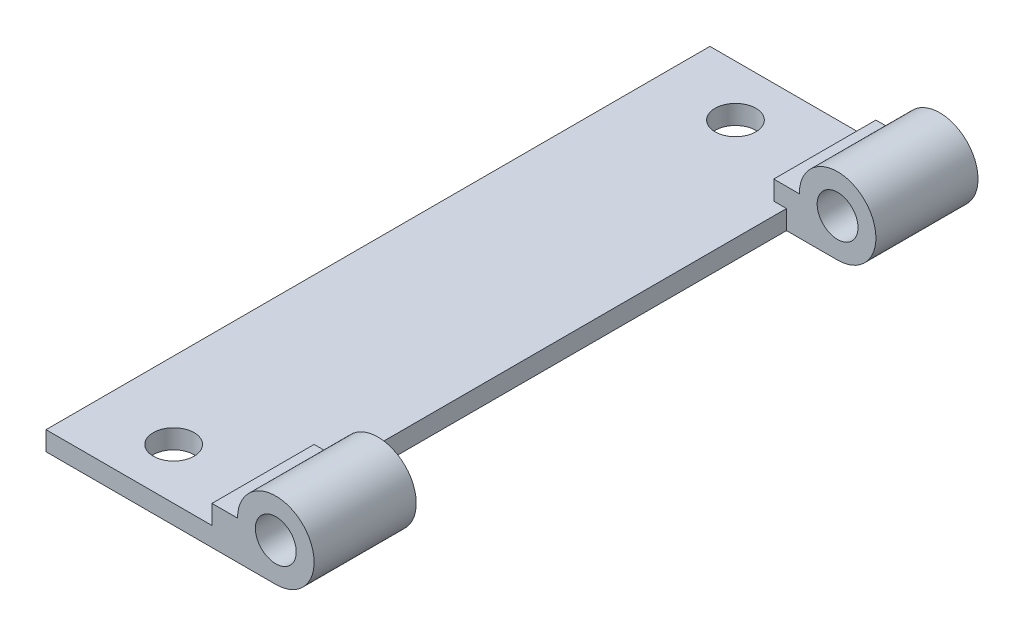
ISO-10303-21;
HEADER;
FILE_DESCRIPTION(('STEP AP214'),'2;1');
FILE_NAME('part.step','',(''),(''),'','','');
FILE_SCHEMA(('AUTOMOTIVE_DESIGN { 1 0 10303 214 1 1 1 1 }'));
ENDSEC;
DATA;
#1=APPLICATION_CONTEXT('core data for automotive mechanical design processes');
#2=APPLICATION_PROTOCOL_DEFINITION('international standard','automotive_design',2000,#1);
#3=PRODUCT_CONTEXT('',#1,'mechanical');
#4=PRODUCT('Part','Part','',(#3));
#5=PRODUCT_RELATED_PRODUCT_CATEGORY('part','',(#4));
#6=PRODUCT_DEFINITION_FORMATION('','',#4);
#7=PRODUCT_DEFINITION_CONTEXT('part definition',#1,'design');
#8=PRODUCT_DEFINITION('design','',#6,#7);
#9=PRODUCT_DEFINITION_SHAPE('','',#8);
#10=(LENGTH_UNIT() NAMED_UNIT(*) SI_UNIT(.MILLI.,.METRE.));
#11=(NAMED_UNIT(*) PLANE_ANGLE_UNIT() SI_UNIT($,.RADIAN.));
#12=(NAMED_UNIT(*) SI_UNIT($,.STERADIAN.) SOLID_ANGLE_UNIT());
#13=UNCERTAINTY_MEASURE_WITH_UNIT(LENGTH_MEASURE(1.E-05),#10,'distance_accuracy_value','');
#14=(GEOMETRIC_REPRESENTATION_CONTEXT(3) GLOBAL_UNCERTAINTY_ASSIGNED_CONTEXT((#13)) GLOBAL_UNIT_ASSIGNED_CONTEXT((#10,
#11,#12)) REPRESENTATION_CONTEXT('',''));
#15=CARTESIAN_POINT('',(0.,0.,0.));
#16=DIRECTION('',(0.,0.,1.));
#17=DIRECTION('',(1.,0.,0.));
#18=AXIS2_PLACEMENT_3D('',#15,#16,#17);
#19=CARTESIAN_POINT('',(0.,0.,26.));
#20=DIRECTION('',(0.,-1.,0.));
#21=DIRECTION('',(0.,0.,-1.));
#22=AXIS2_PLACEMENT_3D('',#19,#20,#21);
#23=PLANE('',#22);
#24=DIRECTION('',(0.,0.,-1.));
#25=VECTOR('',#24,1.);
#26=CARTESIAN_POINT('',(-3.,0.,26.));
#27=LINE('',#26,#25);
#28=CARTESIAN_POINT('',(-3.,0.,18.));
#29=VERTEX_POINT('',#28);
#30=CARTESIAN_POINT('',(-3.,0.,26.));
#31=VERTEX_POINT('',#30);
#32=EDGE_CURVE('E11',#29,#31,#27,.F.);
#33=ORIENTED_EDGE('',*,*,#32,.F.);
#34=DIRECTION('',(-1.,0.,0.));
#35=VECTOR('',#34,1.);
#36=CARTESIAN_POINT('',(0.,0.,18.));
#37=LINE('',#36,#35);
#38=CARTESIAN_POINT('',(-5.,0.,18.));
#39=VERTEX_POINT('',#38);
#40=EDGE_CURVE('E131',#29,#39,#37,.T.);
#41=ORIENTED_EDGE('',*,*,#40,.T.);
#42=DIRECTION('',(0.,0.,-1.));
#43=VECTOR('',#42,1.);
#44=CARTESIAN_POINT('',(-5.,0.,26.));
#45=LINE('',#44,#43);
#46=CARTESIAN_POINT('',(-5.,0.,26.));
#47=VERTEX_POINT('',#46);
#48=EDGE_CURVE('E160',#47,#39,#45,.T.);
#49=ORIENTED_EDGE('',*,*,#48,.F.);
#50=DIRECTION('',(-1.,0.,0.));
#51=VECTOR('',#50,1.);
#52=CARTESIAN_POINT('',(0.,0.,26.));
#53=LINE('',#52,#51);
#54=EDGE_CURVE('E56',#31,#47,#53,.T.);
#55=ORIENTED_EDGE('',*,*,#54,.F.);
#56=EDGE_LOOP('',(#33,#41,#49,#55));
#57=FACE_BOUND('',#56,.T.);
#58=ADVANCED_FACE('F39',(#57),#23,.F.);
#59=CARTESIAN_POINT('',(-4.,-1.5,26.));
#60=DIRECTION('',(0.,-1.,0.));
#61=DIRECTION('',(0.,0.,-1.));
#62=AXIS2_PLACEMENT_3D('',#59,#60,#61);
#63=PLANE('',#62);
#64=CARTESIAN_POINT('',(-12.,-1.5,22.));
#65=DIRECTION('',(0.,-1.,0.));
#66=DIRECTION('',(0.,0.,-1.));
#67=AXIS2_PLACEMENT_3D('',#64,#65,#66);
#68=CIRCLE('',#67,1.6);
#69=CARTESIAN_POINT('',(-12.,-1.5,20.4));
#70=VERTEX_POINT('',#69);
#71=EDGE_CURVE('E235',#70,#70,#68,.T.);
#72=ORIENTED_EDGE('',*,*,#71,.T.);
#73=EDGE_LOOP('',(#72));
#74=FACE_BOUND('',#73,.T.);
#75=CARTESIAN_POINT('',(-12.,-1.5,-22.));
#76=DIRECTION('',(0.,-1.,0.));
#77=DIRECTION('',(0.,0.,-1.));
#78=AXIS2_PLACEMENT_3D('',#75,#76,#77);
#79=CIRCLE('',#78,1.6);
#80=CARTESIAN_POINT('',(-12.,-1.5,-23.6));
#81=VERTEX_POINT('',#80);
#82=EDGE_CURVE('E232',#81,#81,#79,.T.);
#83=ORIENTED_EDGE('',*,*,#82,.T.);
#84=EDGE_LOOP('',(#83));
#85=FACE_BOUND('',#84,.T.);
#86=DIRECTION('',(0.,0.,1.));
#87=VECTOR('',#86,1.);
#88=CARTESIAN_POINT('',(-5.,-1.5,26.));
#89=LINE('',#88,#87);
#90=CARTESIAN_POINT('',(-5.,-1.5,18.));
#91=VERTEX_POINT('',#90);
#92=CARTESIAN_POINT('',(-5.,-1.5,26.));
#93=VERTEX_POINT('',#92);
#94=EDGE_CURVE('E63',#91,#93,#89,.T.);
#95=ORIENTED_EDGE('',*,*,#94,.F.);
#96=DIRECTION('',(-1.,0.,0.));
#97=VECTOR('',#96,1.);
#98=CARTESIAN_POINT('',(-4.,-1.5,18.));
#99=LINE('',#98,#97);
#100=CARTESIAN_POINT('',(-4.,-1.5,18.));
#101=VERTEX_POINT('',#100);
#102=EDGE_CURVE('E166',#101,#91,#99,.T.);
#103=ORIENTED_EDGE('',*,*,#102,.F.);
#104=DIRECTION('',(0.,0.,-1.));
#105=VECTOR('',#104,1.);
#106=CARTESIAN_POINT('',(-4.,-1.5,26.));
#107=LINE('',#106,#105);
#108=CARTESIAN_POINT('',(-4.,-1.5,-18.));
#109=VERTEX_POINT('',#108);
#110=EDGE_CURVE('E215',#101,#109,#107,.T.);
#111=ORIENTED_EDGE('',*,*,#110,.T.);
#112=DIRECTION('',(-1.,0.,0.));
#113=VECTOR('',#112,1.);
#114=CARTESIAN_POINT('',(-4.,-1.5,-18.));
#115=LINE('',#114,#113);
#116=CARTESIAN_POINT('',(-5.,-1.5,-18.));
#117=VERTEX_POINT('',#116);
#118=EDGE_CURVE('E222',#109,#117,#115,.T.);
#119=ORIENTED_EDGE('',*,*,#118,.T.);
#120=DIRECTION('',(0.,0.,1.));
#121=VECTOR('',#120,1.);
#122=CARTESIAN_POINT('',(-5.,-1.5,26.));
#123=LINE('',#122,#121);
#124=CARTESIAN_POINT('',(-5.,-1.5,-26.));
#125=VERTEX_POINT('',#124);
#126=EDGE_CURVE('E192',#125,#117,#123,.T.);
#127=ORIENTED_EDGE('',*,*,#126,.F.);
#128=DIRECTION('',(-1.,0.,0.));
#129=VECTOR('',#128,1.);
#130=CARTESIAN_POINT('',(-4.,-1.5,-26.));
#131=LINE('',#130,#129);
#132=CARTESIAN_POINT('',(-18.,-1.5,-26.));
#133=VERTEX_POINT('',#132);
#134=EDGE_CURVE('E203',#125,#133,#131,.T.);
#135=ORIENTED_EDGE('',*,*,#134,.T.);
#136=DIRECTION('',(0.,0.,-1.));
#137=VECTOR('',#136,1.);
#138=CARTESIAN_POINT('',(-18.,-1.5,26.));
#139=LINE('',#138,#137);
#140=CARTESIAN_POINT('',(-18.,-1.5,26.));
#141=VERTEX_POINT('',#140);
#142=EDGE_CURVE('E207',#141,#133,#139,.T.);
#143=ORIENTED_EDGE('',*,*,#142,.F.);
#144=DIRECTION('',(-1.,0.,0.));
#145=VECTOR('',#144,1.);
#146=CARTESIAN_POINT('',(-4.,-1.5,26.));
#147=LINE('',#146,#145);
#148=EDGE_CURVE('E205',#93,#141,#147,.T.);
#149=ORIENTED_EDGE('',*,*,#148,.F.);
#150=EDGE_LOOP('',(#95,#103,#111,#119,#127,#135,#143,#149));
#151=FACE_BOUND('',#150,.T.);
#152=ADVANCED_FACE('F279',(#74,#85,#151),#63,.F.);
#153=CARTESIAN_POINT('',(-4.,-3.,26.));
#154=DIRECTION('',(-1.,0.,0.));
#155=DIRECTION('',(0.,0.,1.));
#156=AXIS2_PLACEMENT_3D('',#153,#154,#155);
#157=PLANE('',#156);
#158=DIRECTION('',(0.,1.,0.));
#159=VECTOR('',#158,1.);
#160=CARTESIAN_POINT('',(-4.,-3.,18.));
#161=LINE('',#160,#159);
#162=CARTESIAN_POINT('',(-4.,-3.,18.));
#163=VERTEX_POINT('',#162);
#164=EDGE_CURVE('E48',#163,#101,#161,.T.);
#165=ORIENTED_EDGE('',*,*,#164,.F.);
#166=DIRECTION('',(0.,0.,-1.));
#167=VECTOR('',#166,1.);
#168=CARTESIAN_POINT('',(-4.,-3.,26.));
#169=LINE('',#168,#167);
#170=CARTESIAN_POINT('',(-4.,-3.,-18.));
#171=VERTEX_POINT('',#170);
#172=EDGE_CURVE('E217',#163,#171,#169,.T.);
#173=ORIENTED_EDGE('',*,*,#172,.T.);
#174=DIRECTION('',(0.,1.,0.));
#175=VECTOR('',#174,1.);
#176=CARTESIAN_POINT('',(-4.,-3.,-18.));
#177=LINE('',#176,#175);
#178=EDGE_CURVE('E195',#171,#109,#177,.T.);
#179=ORIENTED_EDGE('',*,*,#178,.T.);
#180=ORIENTED_EDGE('',*,*,#110,.F.);
#181=EDGE_LOOP('',(#165,#173,#179,#180));
#182=FACE_BOUND('',#181,.T.);
#183=ADVANCED_FACE('F287',(#182),#157,.F.);
#184=CARTESIAN_POINT('',(0.,0.,-18.));
#185=DIRECTION('',(0.,-1.,0.));
#186=DIRECTION('',(0.,0.,-1.));
#187=AXIS2_PLACEMENT_3D('',#184,#185,#186);
#188=PLANE('',#187);
#189=DIRECTION('',(0.,0.,-1.));
#190=VECTOR('',#189,1.);
#191=CARTESIAN_POINT('',(-3.,0.,-18.));
#192=LINE('',#191,#190);
#193=CARTESIAN_POINT('',(-3.,0.,-26.));
#194=VERTEX_POINT('',#193);
#195=CARTESIAN_POINT('',(-3.,0.,-18.));
#196=VERTEX_POINT('',#195);
#197=EDGE_CURVE('E224',#194,#196,#192,.F.);
#198=ORIENTED_EDGE('',*,*,#197,.F.);
#199=DIRECTION('',(-1.,0.,0.));
#200=VECTOR('',#199,1.);
#201=CARTESIAN_POINT('',(0.,0.,-26.));
#202=LINE('',#201,#200);
#203=CARTESIAN_POINT('',(-5.,0.,-26.));
#204=VERTEX_POINT('',#203);
#205=EDGE_CURVE('E179',#194,#204,#202,.T.);
#206=ORIENTED_EDGE('',*,*,#205,.T.);
#207=DIRECTION('',(0.,0.,-1.));
#208=VECTOR('',#207,1.);
#209=CARTESIAN_POINT('',(-5.,0.,-18.));
#210=LINE('',#209,#208);
#211=CARTESIAN_POINT('',(-5.,0.,-18.));
#212=VERTEX_POINT('',#211);
#213=EDGE_CURVE('E183',#212,#204,#210,.T.);
#214=ORIENTED_EDGE('',*,*,#213,.F.);
#215=DIRECTION('',(-1.,0.,0.));
#216=VECTOR('',#215,1.);
#217=CARTESIAN_POINT('',(0.,0.,-18.));
#218=LINE('',#217,#216);
#219=EDGE_CURVE('E181',#196,#212,#218,.T.);
#220=ORIENTED_EDGE('',*,*,#219,.F.);
#221=EDGE_LOOP('',(#198,#206,#214,#220));
#222=FACE_BOUND('',#221,.T.);
#223=ADVANCED_FACE('F264',(#222),#188,.F.);
#224=CARTESIAN_POINT('',(-18.,-1.5,26.));
#225=DIRECTION('',(1.,0.,0.));
#226=DIRECTION('',(0.,0.,-1.));
#227=AXIS2_PLACEMENT_3D('',#224,#225,#226);
#228=PLANE('',#227);
#229=DIRECTION('',(0.,-1.,0.));
#230=VECTOR('',#229,1.);
#231=CARTESIAN_POINT('',(-18.,-1.5,-26.));
#232=LINE('',#231,#230);
#233=CARTESIAN_POINT('',(-18.,-3.,-26.));
#234=VERTEX_POINT('',#233);
#235=EDGE_CURVE('E198',#133,#234,#232,.T.);
#236=ORIENTED_EDGE('',*,*,#235,.T.);
#237=DIRECTION('',(0.,0.,-1.));
#238=VECTOR('',#237,1.);
#239=CARTESIAN_POINT('',(-18.,-3.,26.));
#240=LINE('',#239,#238);
#241=CARTESIAN_POINT('',(-18.,-3.,26.));
#242=VERTEX_POINT('',#241);
#243=EDGE_CURVE('E219',#242,#234,#240,.T.);
#244=ORIENTED_EDGE('',*,*,#243,.F.);
#245=DIRECTION('',(0.,-1.,0.));
#246=VECTOR('',#245,1.);
#247=CARTESIAN_POINT('',(-18.,-1.5,26.));
#248=LINE('',#247,#246);
#249=EDGE_CURVE('E199',#141,#242,#248,.T.);
#250=ORIENTED_EDGE('',*,*,#249,.F.);
#251=ORIENTED_EDGE('',*,*,#142,.T.);
#252=EDGE_LOOP('',(#236,#244,#250,#251));
#253=FACE_BOUND('',#252,.T.);
#254=ADVANCED_FACE('F41',(#253),#228,.F.);
#255=CARTESIAN_POINT('',(-18.,-3.,26.));
#256=DIRECTION('',(0.,1.,0.));
#257=DIRECTION('',(0.,0.,1.));
#258=AXIS2_PLACEMENT_3D('',#255,#256,#257);
#259=PLANE('',#258);
#260=CARTESIAN_POINT('',(-12.,-3.,22.));
#261=DIRECTION('',(0.,1.,0.));
#262=DIRECTION('',(0.,0.,1.));
#263=AXIS2_PLACEMENT_3D('',#260,#261,#262);
#264=CIRCLE('',#263,1.6);
#265=CARTESIAN_POINT('',(-12.,-3.,23.6));
#266=VERTEX_POINT('',#265);
#267=EDGE_CURVE('E43',#266,#266,#264,.T.);
#268=ORIENTED_EDGE('',*,*,#267,.T.);
#269=EDGE_LOOP('',(#268));
#270=FACE_BOUND('',#269,.T.);
#271=CARTESIAN_POINT('',(-12.,-3.,-22.));
#272=DIRECTION('',(0.,1.,0.));
#273=DIRECTION('',(0.,0.,1.));
#274=AXIS2_PLACEMENT_3D('',#271,#272,#273);
#275=CIRCLE('',#274,1.6);
#276=CARTESIAN_POINT('',(-12.,-3.,-20.4));
#277=VERTEX_POINT('',#276);
#278=EDGE_CURVE('E233',#277,#277,#275,.T.);
#279=ORIENTED_EDGE('',*,*,#278,.T.);
#280=EDGE_LOOP('',(#279));
#281=FACE_BOUND('',#280,.T.);
#282=DIRECTION('',(0.,0.,-1.));
#283=VECTOR('',#282,1.);
#284=CARTESIAN_POINT('',(0.,-3.,26.));
#285=LINE('',#284,#283);
#286=CARTESIAN_POINT('',(0.,-3.,26.));
#287=VERTEX_POINT('',#286);
#288=CARTESIAN_POINT('',(0.,-3.,18.));
#289=VERTEX_POINT('',#288);
#290=EDGE_CURVE('E148',#287,#289,#285,.T.);
#291=ORIENTED_EDGE('',*,*,#290,.F.);
#292=DIRECTION('',(1.,0.,0.));
#293=VECTOR('',#292,1.);
#294=CARTESIAN_POINT('',(-18.,-3.,26.));
#295=LINE('',#294,#293);
#296=EDGE_CURVE('E202',#242,#287,#295,.T.);
#297=ORIENTED_EDGE('',*,*,#296,.F.);
#298=ORIENTED_EDGE('',*,*,#243,.T.);
#299=DIRECTION('',(1.,0.,0.));
#300=VECTOR('',#299,1.);
#301=CARTESIAN_POINT('',(-18.,-3.,-26.));
#302=LINE('',#301,#300);
#303=CARTESIAN_POINT('',(0.,-3.,-26.));
#304=VERTEX_POINT('',#303);
#305=EDGE_CURVE('E210',#234,#304,#302,.T.);
#306=ORIENTED_EDGE('',*,*,#305,.T.);
#307=DIRECTION('',(0.,0.,-1.));
#308=VECTOR('',#307,1.);
#309=CARTESIAN_POINT('',(0.,-3.,-18.));
#310=LINE('',#309,#308);
#311=CARTESIAN_POINT('',(0.,-3.,-18.));
#312=VERTEX_POINT('',#311);
#313=EDGE_CURVE('E189',#312,#304,#310,.T.);
#314=ORIENTED_EDGE('',*,*,#313,.F.);
#315=DIRECTION('',(1.,0.,0.));
#316=VECTOR('',#315,1.);
#317=CARTESIAN_POINT('',(-5.,-3.,-18.));
#318=LINE('',#317,#316);
#319=EDGE_CURVE('E178',#171,#312,#318,.T.);
#320=ORIENTED_EDGE('',*,*,#319,.F.);
#321=ORIENTED_EDGE('',*,*,#172,.F.);
#322=DIRECTION('',(1.,0.,0.));
#323=VECTOR('',#322,1.);
#324=CARTESIAN_POINT('',(-5.,-3.,18.));
#325=LINE('',#324,#323);
#326=EDGE_CURVE('E140',#163,#289,#325,.T.);
#327=ORIENTED_EDGE('',*,*,#326,.T.);
#328=EDGE_LOOP('',(#291,#297,#298,#306,#314,#320,#321,#327));
#329=FACE_BOUND('',#328,.T.);
#330=ADVANCED_FACE('F271',(#270,#281,#329),#259,.F.);
#331=CARTESIAN_POINT('',(0.,0.,26.));
#332=DIRECTION('',(0.,0.,1.));
#333=DIRECTION('',(1.,0.,0.));
#334=AXIS2_PLACEMENT_3D('',#331,#332,#333);
#335=PLANE('',#334);
#336=CARTESIAN_POINT('',(0.,0.,26.));
#337=DIRECTION('',(0.,0.,1.));
#338=DIRECTION('',(1.,0.,0.));
#339=AXIS2_PLACEMENT_3D('',#336,#337,#338);
#340=CIRCLE('',#339,1.6);
#341=CARTESIAN_POINT('',(1.6,0.,26.));
#342=VERTEX_POINT('',#341);
#343=EDGE_CURVE('E150',#342,#342,#340,.F.);
#344=ORIENTED_EDGE('',*,*,#343,.T.);
#345=EDGE_LOOP('',(#344));
#346=FACE_BOUND('',#345,.T.);
#347=ORIENTED_EDGE('',*,*,#296,.T.);
#348=CARTESIAN_POINT('',(0.,0.,26.));
#349=DIRECTION('',(0.,0.,1.));
#350=DIRECTION('',(1.,0.,0.));
#351=AXIS2_PLACEMENT_3D('',#348,#349,#350);
#352=CIRCLE('',#351,3.);
#353=EDGE_CURVE('E149',#287,#31,#352,.T.);
#354=ORIENTED_EDGE('',*,*,#353,.T.);
#355=ORIENTED_EDGE('',*,*,#54,.T.);
#356=DIRECTION('',(0.,-1.,0.));
#357=VECTOR('',#356,1.);
#358=CARTESIAN_POINT('',(-5.,0.,26.));
#359=LINE('',#358,#357);
#360=EDGE_CURVE('E139',#47,#93,#359,.T.);
#361=ORIENTED_EDGE('',*,*,#360,.T.);
#362=ORIENTED_EDGE('',*,*,#148,.T.);
#363=ORIENTED_EDGE('',*,*,#249,.T.);
#364=EDGE_LOOP('',(#347,#354,#355,#361,#362,#363));
#365=FACE_BOUND('',#364,.T.);
#366=ADVANCED_FACE('F257',(#346,#365),#335,.T.);
#367=CARTESIAN_POINT('',(0.,0.,-26.));
#368=DIRECTION('',(0.,0.,1.));
#369=DIRECTION('',(1.,0.,0.));
#370=AXIS2_PLACEMENT_3D('',#367,#368,#369);
#371=PLANE('',#370);
#372=CARTESIAN_POINT('',(0.,0.,-26.));
#373=DIRECTION('',(0.,0.,1.));
#374=DIRECTION('',(1.,0.,0.));
#375=AXIS2_PLACEMENT_3D('',#372,#373,#374);
#376=CIRCLE('',#375,1.6);
#377=CARTESIAN_POINT('',(1.6,0.,-26.));
#378=VERTEX_POINT('',#377);
#379=EDGE_CURVE('E154',#378,#378,#376,.F.);
#380=ORIENTED_EDGE('',*,*,#379,.F.);
#381=EDGE_LOOP('',(#380));
#382=FACE_BOUND('',#381,.T.);
#383=ORIENTED_EDGE('',*,*,#205,.F.);
#384=CARTESIAN_POINT('',(0.,0.,-26.));
#385=DIRECTION('',(0.,0.,1.));
#386=DIRECTION('',(1.,0.,0.));
#387=AXIS2_PLACEMENT_3D('',#384,#385,#386);
#388=CIRCLE('',#387,3.);
#389=EDGE_CURVE('E168',#304,#194,#388,.T.);
#390=ORIENTED_EDGE('',*,*,#389,.F.);
#391=ORIENTED_EDGE('',*,*,#305,.F.);
#392=ORIENTED_EDGE('',*,*,#235,.F.);
#393=ORIENTED_EDGE('',*,*,#134,.F.);
#394=DIRECTION('',(0.,-1.,0.));
#395=VECTOR('',#394,1.);
#396=CARTESIAN_POINT('',(-5.,0.,-26.));
#397=LINE('',#396,#395);
#398=EDGE_CURVE('E172',#204,#125,#397,.T.);
#399=ORIENTED_EDGE('',*,*,#398,.F.);
#400=EDGE_LOOP('',(#383,#390,#391,#392,#393,#399));
#401=FACE_BOUND('',#400,.T.);
#402=ADVANCED_FACE('F253',(#382,#401),#371,.F.);
#403=CARTESIAN_POINT('',(0.,0.,-18.));
#404=DIRECTION('',(0.,0.,1.));
#405=DIRECTION('',(1.,0.,0.));
#406=AXIS2_PLACEMENT_3D('',#403,#404,#405);
#407=PLANE('',#406);
#408=CARTESIAN_POINT('',(0.,0.,-18.));
#409=DIRECTION('',(0.,0.,1.));
#410=DIRECTION('',(1.,0.,0.));
#411=AXIS2_PLACEMENT_3D('',#408,#409,#410);
#412=CIRCLE('',#411,1.6);
#413=CARTESIAN_POINT('',(1.6,0.,-18.));
#414=VERTEX_POINT('',#413);
#415=EDGE_CURVE('E231',#414,#414,#412,.F.);
#416=ORIENTED_EDGE('',*,*,#415,.T.);
#417=EDGE_LOOP('',(#416));
#418=FACE_BOUND('',#417,.T.);
#419=ORIENTED_EDGE('',*,*,#319,.T.);
#420=CARTESIAN_POINT('',(0.,0.,-18.));
#421=DIRECTION('',(0.,0.,1.));
#422=DIRECTION('',(1.,0.,0.));
#423=AXIS2_PLACEMENT_3D('',#420,#421,#422);
#424=CIRCLE('',#423,3.);
#425=EDGE_CURVE('E169',#312,#196,#424,.T.);
#426=ORIENTED_EDGE('',*,*,#425,.T.);
#427=ORIENTED_EDGE('',*,*,#219,.T.);
#428=DIRECTION('',(0.,-1.,0.));
#429=VECTOR('',#428,1.);
#430=CARTESIAN_POINT('',(-5.,0.,-18.));
#431=LINE('',#430,#429);
#432=EDGE_CURVE('E175',#212,#117,#431,.T.);
#433=ORIENTED_EDGE('',*,*,#432,.T.);
#434=ORIENTED_EDGE('',*,*,#118,.F.);
#435=ORIENTED_EDGE('',*,*,#178,.F.);
#436=EDGE_LOOP('',(#419,#426,#427,#433,#434,#435));
#437=FACE_BOUND('',#436,.T.);
#438=ADVANCED_FACE('F256',(#418,#437),#407,.T.);
#439=CARTESIAN_POINT('',(-5.,0.,-18.));
#440=DIRECTION('',(1.,0.,0.));
#441=DIRECTION('',(0.,0.,-1.));
#442=AXIS2_PLACEMENT_3D('',#439,#440,#441);
#443=PLANE('',#442);
#444=ORIENTED_EDGE('',*,*,#398,.T.);
#445=ORIENTED_EDGE('',*,*,#126,.T.);
#446=ORIENTED_EDGE('',*,*,#432,.F.);
#447=ORIENTED_EDGE('',*,*,#213,.T.);
#448=EDGE_LOOP('',(#444,#445,#446,#447));
#449=FACE_BOUND('',#448,.T.);
#450=ADVANCED_FACE('F283',(#449),#443,.F.);
#451=CARTESIAN_POINT('',(0.,0.,-18.));
#452=DIRECTION('',(0.,0.,-1.));
#453=DIRECTION('',(-1.,0.,0.));
#454=AXIS2_PLACEMENT_3D('',#451,#452,#453);
#455=CYLINDRICAL_SURFACE('',#454,3.);
#456=ORIENTED_EDGE('',*,*,#425,.F.);
#457=ORIENTED_EDGE('',*,*,#313,.T.);
#458=ORIENTED_EDGE('',*,*,#389,.T.);
#459=ORIENTED_EDGE('',*,*,#197,.T.);
#460=EDGE_LOOP('',(#456,#457,#458,#459));
#461=FACE_BOUND('',#460,.T.);
#462=ADVANCED_FACE('F267',(#461),#455,.T.);
#463=CARTESIAN_POINT('',(0.,0.,18.));
#464=DIRECTION('',(0.,0.,1.));
#465=DIRECTION('',(1.,0.,0.));
#466=AXIS2_PLACEMENT_3D('',#463,#464,#465);
#467=PLANE('',#466);
#468=CARTESIAN_POINT('',(0.,0.,18.));
#469=DIRECTION('',(0.,0.,1.));
#470=DIRECTION('',(1.,0.,0.));
#471=AXIS2_PLACEMENT_3D('',#468,#469,#470);
#472=CIRCLE('',#471,1.6);
#473=CARTESIAN_POINT('',(1.6,0.,18.));
#474=VERTEX_POINT('',#473);
#475=EDGE_CURVE('E229',#474,#474,#472,.F.);
#476=ORIENTED_EDGE('',*,*,#475,.F.);
#477=EDGE_LOOP('',(#476));
#478=FACE_BOUND('',#477,.T.);
#479=ORIENTED_EDGE('',*,*,#40,.F.);
#480=CARTESIAN_POINT('',(0.,0.,18.));
#481=DIRECTION('',(0.,0.,1.));
#482=DIRECTION('',(1.,0.,0.));
#483=AXIS2_PLACEMENT_3D('',#480,#481,#482);
#484=CIRCLE('',#483,3.);
#485=EDGE_CURVE('E135',#289,#29,#484,.T.);
#486=ORIENTED_EDGE('',*,*,#485,.F.);
#487=ORIENTED_EDGE('',*,*,#326,.F.);
#488=ORIENTED_EDGE('',*,*,#164,.T.);
#489=ORIENTED_EDGE('',*,*,#102,.T.);
#490=DIRECTION('',(0.,-1.,0.));
#491=VECTOR('',#490,1.);
#492=CARTESIAN_POINT('',(-5.,0.,18.));
#493=LINE('',#492,#491);
#494=EDGE_CURVE('E137',#39,#91,#493,.T.);
#495=ORIENTED_EDGE('',*,*,#494,.F.);
#496=EDGE_LOOP('',(#479,#486,#487,#488,#489,#495));
#497=FACE_BOUND('',#496,.T.);
#498=ADVANCED_FACE('F132',(#478,#497),#467,.F.);
#499=CARTESIAN_POINT('',(-5.,0.,26.));
#500=DIRECTION('',(1.,0.,0.));
#501=DIRECTION('',(0.,0.,-1.));
#502=AXIS2_PLACEMENT_3D('',#499,#500,#501);
#503=PLANE('',#502);
#504=ORIENTED_EDGE('',*,*,#494,.T.);
#505=ORIENTED_EDGE('',*,*,#94,.T.);
#506=ORIENTED_EDGE('',*,*,#360,.F.);
#507=ORIENTED_EDGE('',*,*,#48,.T.);
#508=EDGE_LOOP('',(#504,#505,#506,#507));
#509=FACE_BOUND('',#508,.T.);
#510=ADVANCED_FACE('F289',(#509),#503,.F.);
#511=CARTESIAN_POINT('',(0.,0.,26.));
#512=DIRECTION('',(0.,0.,-1.));
#513=DIRECTION('',(-1.,0.,0.));
#514=AXIS2_PLACEMENT_3D('',#511,#512,#513);
#515=CYLINDRICAL_SURFACE('',#514,3.);
#516=ORIENTED_EDGE('',*,*,#353,.F.);
#517=ORIENTED_EDGE('',*,*,#290,.T.);
#518=ORIENTED_EDGE('',*,*,#485,.T.);
#519=ORIENTED_EDGE('',*,*,#32,.T.);
#520=EDGE_LOOP('',(#516,#517,#518,#519));
#521=FACE_BOUND('',#520,.T.);
#522=ADVANCED_FACE('F146',(#521),#515,.T.);
#523=CARTESIAN_POINT('',(0.,0.,28.));
#524=DIRECTION('',(0.,0.,-1.));
#525=DIRECTION('',(-1.,0.,0.));
#526=AXIS2_PLACEMENT_3D('',#523,#524,#525);
#527=CYLINDRICAL_SURFACE('',#526,1.6);
#528=ORIENTED_EDGE('',*,*,#343,.F.);
#529=EDGE_LOOP('',(#528));
#530=FACE_BOUND('',#529,.T.);
#531=ORIENTED_EDGE('',*,*,#475,.T.);
#532=EDGE_LOOP('',(#531));
#533=FACE_BOUND('',#532,.T.);
#534=ADVANCED_FACE('F346',(#530,#533),#527,.F.);
#535=ORIENTED_EDGE('',*,*,#415,.F.);
#536=EDGE_LOOP('',(#535));
#537=FACE_BOUND('',#536,.T.);
#538=ORIENTED_EDGE('',*,*,#379,.T.);
#539=EDGE_LOOP('',(#538));
#540=FACE_BOUND('',#539,.T.);
#541=ADVANCED_FACE('F251',(#537,#540),#527,.F.);
#542=CARTESIAN_POINT('',(-12.,-100.,-22.));
#543=DIRECTION('',(0.,1.,0.));
#544=DIRECTION('',(0.,0.,1.));
#545=AXIS2_PLACEMENT_3D('',#542,#543,#544);
#546=CYLINDRICAL_SURFACE('',#545,1.6);
#547=ORIENTED_EDGE('',*,*,#278,.F.);
#548=EDGE_LOOP('',(#547));
#549=FACE_BOUND('',#548,.T.);
#550=ORIENTED_EDGE('',*,*,#82,.F.);
#551=EDGE_LOOP('',(#550));
#552=FACE_BOUND('',#551,.T.);
#553=ADVANCED_FACE('F358',(#549,#552),#546,.F.);
#554=CARTESIAN_POINT('',(-12.,-100.,22.));
#555=DIRECTION('',(0.,1.,0.));
#556=DIRECTION('',(0.,0.,1.));
#557=AXIS2_PLACEMENT_3D('',#554,#555,#556);
#558=CYLINDRICAL_SURFACE('',#557,1.6);
#559=ORIENTED_EDGE('',*,*,#267,.F.);
#560=EDGE_LOOP('',(#559));
#561=FACE_BOUND('',#560,.T.);
#562=ORIENTED_EDGE('',*,*,#71,.F.);
#563=EDGE_LOOP('',(#562));
#564=FACE_BOUND('',#563,.T.);
#565=ADVANCED_FACE('F365',(#561,#564),#558,.F.);
#566=CLOSED_SHELL('',(#58,#152,#183,#223,#254,#330,#366,#402,#438,#450,#462,#498,#510,#522,#534,
#541,#553,#565));
#567=MANIFOLD_SOLID_BREP('B2',#566);
#568=ADVANCED_BREP_SHAPE_REPRESENTATION('',(#18,#567),#14);
#569=SHAPE_DEFINITION_REPRESENTATION(#9,#568);
ENDSEC;
END-ISO-10303-21;
